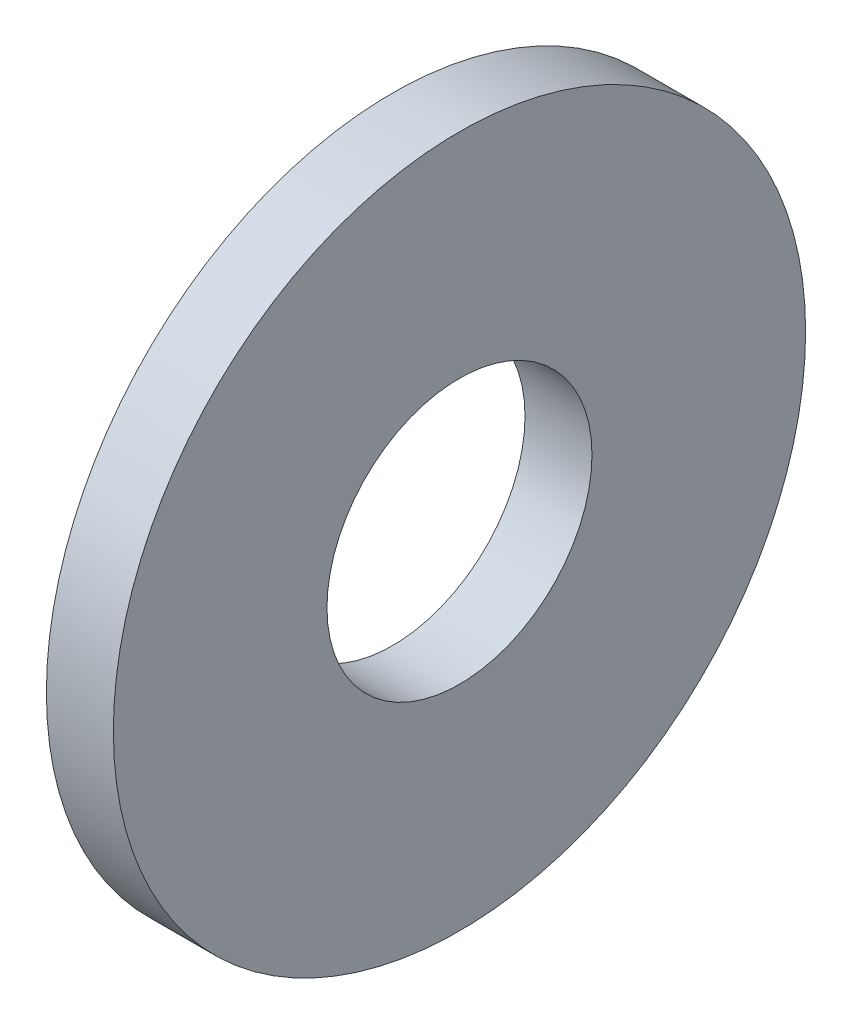
ISO-10303-21;
HEADER;
FILE_DESCRIPTION(('STEP AP214'),'2;1');
FILE_NAME('part.step','',(''),(''),'','','');
FILE_SCHEMA(('AUTOMOTIVE_DESIGN { 1 0 10303 214 1 1 1 1 }'));
ENDSEC;
DATA;
#1=APPLICATION_CONTEXT('core data for automotive mechanical design processes');
#2=APPLICATION_PROTOCOL_DEFINITION('international standard','automotive_design',2000,#1);
#3=PRODUCT_CONTEXT('',#1,'mechanical');
#4=PRODUCT('Part','Part','',(#3));
#5=PRODUCT_RELATED_PRODUCT_CATEGORY('part','',(#4));
#6=PRODUCT_DEFINITION_FORMATION('','',#4);
#7=PRODUCT_DEFINITION_CONTEXT('part definition',#1,'design');
#8=PRODUCT_DEFINITION('design','',#6,#7);
#9=PRODUCT_DEFINITION_SHAPE('','',#8);
#10=(LENGTH_UNIT() NAMED_UNIT(*) SI_UNIT(.MILLI.,.METRE.));
#11=(NAMED_UNIT(*) PLANE_ANGLE_UNIT() SI_UNIT($,.RADIAN.));
#12=(NAMED_UNIT(*) SI_UNIT($,.STERADIAN.) SOLID_ANGLE_UNIT());
#13=UNCERTAINTY_MEASURE_WITH_UNIT(LENGTH_MEASURE(1.E-05),#10,'distance_accuracy_value','');
#14=(GEOMETRIC_REPRESENTATION_CONTEXT(3) GLOBAL_UNCERTAINTY_ASSIGNED_CONTEXT((#13)) GLOBAL_UNIT_ASSIGNED_CONTEXT((#10,
#11,#12)) REPRESENTATION_CONTEXT('',''));
#15=CARTESIAN_POINT('',(0.,0.,0.));
#16=DIRECTION('',(0.,0.,1.));
#17=DIRECTION('',(1.,0.,0.));
#18=AXIS2_PLACEMENT_3D('',#15,#16,#17);
#19=CARTESIAN_POINT('',(1.8034,0.,0.));
#20=DIRECTION('',(1.,0.,0.));
#21=DIRECTION('',(0.,0.,-1.));
#22=AXIS2_PLACEMENT_3D('',#19,#20,#21);
#23=PLANE('',#22);
#24=CARTESIAN_POINT('',(1.8034,0.,0.));
#25=DIRECTION('',(1.,0.,0.));
#26=DIRECTION('',(0.,0.,-1.));
#27=AXIS2_PLACEMENT_3D('',#24,#25,#26);
#28=CIRCLE('',#27,9.3218);
#29=CARTESIAN_POINT('',(1.8034,0.,-9.3218));
#30=VERTEX_POINT('',#29);
#31=EDGE_CURVE('E10',#30,#30,#28,.T.);
#32=ORIENTED_EDGE('',*,*,#31,.T.);
#33=EDGE_LOOP('',(#32));
#34=FACE_BOUND('',#33,.T.);
#35=CARTESIAN_POINT('',(1.8034,0.,0.));
#36=DIRECTION('',(1.,0.,0.));
#37=DIRECTION('',(0.,0.,-1.));
#38=AXIS2_PLACEMENT_3D('',#35,#36,#37);
#39=CIRCLE('',#38,3.5687);
#40=CARTESIAN_POINT('',(1.8034,0.,-3.5687));
#41=VERTEX_POINT('',#40);
#42=EDGE_CURVE('E41',#41,#41,#39,.T.);
#43=ORIENTED_EDGE('',*,*,#42,.F.);
#44=EDGE_LOOP('',(#43));
#45=FACE_BOUND('',#44,.T.);
#46=ADVANCED_FACE('F30',(#34,#45),#23,.T.);
#47=CARTESIAN_POINT('',(0.,0.,0.));
#48=DIRECTION('',(1.,0.,0.));
#49=DIRECTION('',(0.,0.,-1.));
#50=AXIS2_PLACEMENT_3D('',#47,#48,#49);
#51=PLANE('',#50);
#52=CARTESIAN_POINT('',(0.,0.,0.));
#53=DIRECTION('',(1.,0.,0.));
#54=DIRECTION('',(0.,0.,-1.));
#55=AXIS2_PLACEMENT_3D('',#52,#53,#54);
#56=CIRCLE('',#55,9.3218);
#57=CARTESIAN_POINT('',(0.,0.,-9.3218));
#58=VERTEX_POINT('',#57);
#59=EDGE_CURVE('E34',#58,#58,#56,.T.);
#60=ORIENTED_EDGE('',*,*,#59,.F.);
#61=EDGE_LOOP('',(#60));
#62=FACE_BOUND('',#61,.T.);
#63=CARTESIAN_POINT('',(0.,0.,0.));
#64=DIRECTION('',(1.,0.,0.));
#65=DIRECTION('',(0.,0.,-1.));
#66=AXIS2_PLACEMENT_3D('',#63,#64,#65);
#67=CIRCLE('',#66,3.5687);
#68=CARTESIAN_POINT('',(0.,0.,-3.5687));
#69=VERTEX_POINT('',#68);
#70=EDGE_CURVE('E43',#69,#69,#67,.T.);
#71=ORIENTED_EDGE('',*,*,#70,.T.);
#72=EDGE_LOOP('',(#71));
#73=FACE_BOUND('',#72,.T.);
#74=ADVANCED_FACE('F53',(#62,#73),#51,.F.);
#75=CARTESIAN_POINT('',(1.8034,0.,0.));
#76=DIRECTION('',(-1.,0.,0.));
#77=DIRECTION('',(0.,0.,1.));
#78=AXIS2_PLACEMENT_3D('',#75,#76,#77);
#79=CYLINDRICAL_SURFACE('',#78,9.3218);
#80=ORIENTED_EDGE('',*,*,#31,.F.);
#81=EDGE_LOOP('',(#80));
#82=FACE_BOUND('',#81,.T.);
#83=ORIENTED_EDGE('',*,*,#59,.T.);
#84=EDGE_LOOP('',(#83));
#85=FACE_BOUND('',#84,.T.);
#86=ADVANCED_FACE('F32',(#82,#85),#79,.T.);
#87=CARTESIAN_POINT('',(1.8034,0.,0.));
#88=DIRECTION('',(-1.,0.,0.));
#89=DIRECTION('',(0.,0.,1.));
#90=AXIS2_PLACEMENT_3D('',#87,#88,#89);
#91=CYLINDRICAL_SURFACE('',#90,3.5687);
#92=ORIENTED_EDGE('',*,*,#42,.T.);
#93=EDGE_LOOP('',(#92));
#94=FACE_BOUND('',#93,.T.);
#95=ORIENTED_EDGE('',*,*,#70,.F.);
#96=EDGE_LOOP('',(#95));
#97=FACE_BOUND('',#96,.T.);
#98=ADVANCED_FACE('F49',(#94,#97),#91,.F.);
#99=CLOSED_SHELL('',(#46,#74,#86,#98));
#100=MANIFOLD_SOLID_BREP('B2',#99);
#101=ADVANCED_BREP_SHAPE_REPRESENTATION('',(#18,#100),#14);
#102=SHAPE_DEFINITION_REPRESENTATION(#9,#101);
ENDSEC;
END-ISO-10303-21;
